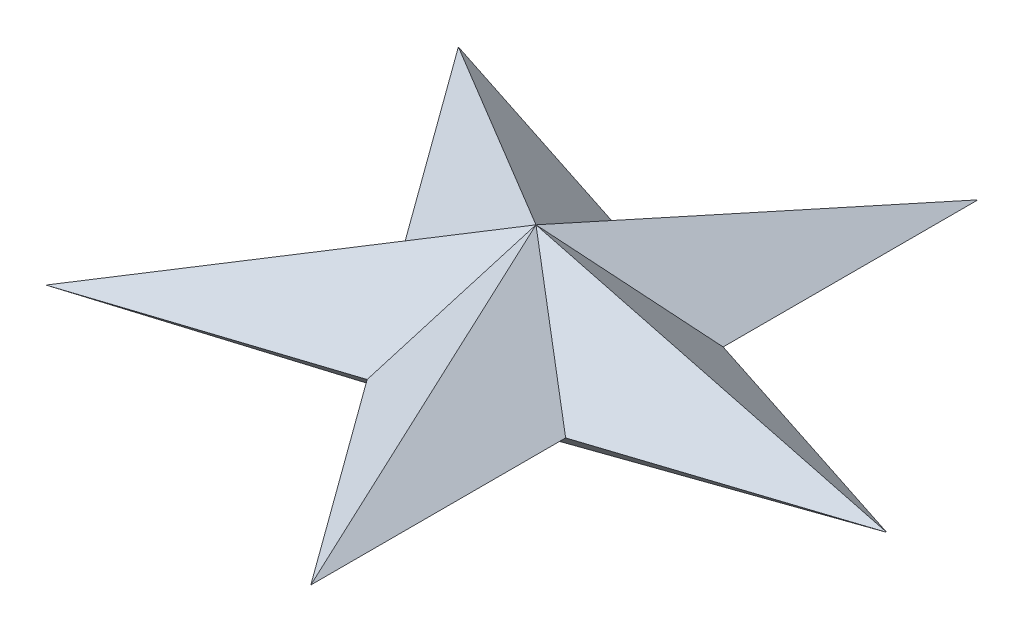
ISO-10303-21;
HEADER;
FILE_DESCRIPTION(('STEP AP214'),'2;1');
FILE_NAME('part.step','',(''),(''),'','','');
FILE_SCHEMA(('AUTOMOTIVE_DESIGN { 1 0 10303 214 1 1 1 1 }'));
ENDSEC;
DATA;
#1=APPLICATION_CONTEXT('core data for automotive mechanical design processes');
#2=APPLICATION_PROTOCOL_DEFINITION('international standard','automotive_design',2000,#1);
#3=PRODUCT_CONTEXT('',#1,'mechanical');
#4=PRODUCT('Part','Part','',(#3));
#5=PRODUCT_RELATED_PRODUCT_CATEGORY('part','',(#4));
#6=PRODUCT_DEFINITION_FORMATION('','',#4);
#7=PRODUCT_DEFINITION_CONTEXT('part definition',#1,'design');
#8=PRODUCT_DEFINITION('design','',#6,#7);
#9=PRODUCT_DEFINITION_SHAPE('','',#8);
#10=(LENGTH_UNIT() NAMED_UNIT(*) SI_UNIT(.MILLI.,.METRE.));
#11=(NAMED_UNIT(*) PLANE_ANGLE_UNIT() SI_UNIT($,.RADIAN.));
#12=(NAMED_UNIT(*) SI_UNIT($,.STERADIAN.) SOLID_ANGLE_UNIT());
#13=UNCERTAINTY_MEASURE_WITH_UNIT(LENGTH_MEASURE(1.E-05),#10,'distance_accuracy_value','');
#14=(GEOMETRIC_REPRESENTATION_CONTEXT(3) GLOBAL_UNCERTAINTY_ASSIGNED_CONTEXT((#13)) GLOBAL_UNIT_ASSIGNED_CONTEXT((#10,
#11,#12)) REPRESENTATION_CONTEXT('',''));
#15=CARTESIAN_POINT('',(0.,0.,0.));
#16=DIRECTION('',(0.,0.,1.));
#17=DIRECTION('',(1.,0.,0.));
#18=AXIS2_PLACEMENT_3D('',#15,#16,#17);
#19=CARTESIAN_POINT('',(-23.606797749979,0.,0.));
#20=DIRECTION('',(-0.52002610001006,-0.766044443118979,0.377821077330077));
#21=DIRECTION('',(0.827370262224102,-0.561656878518567,0.));
#22=AXIS2_PLACEMENT_3D('',#19,#20,#21);
#23=PLANE('',#22);
#24=DIRECTION('',(0.587785252292473,0.,0.809016994374948));
#25=VECTOR('',#24,1.);
#26=CARTESIAN_POINT('',(-23.606797749979,0.,0.));
#27=LINE('',#26,#25);
#28=CARTESIAN_POINT('',(-50.0000000000001,0.,-36.3271264002682));
#29=VERTEX_POINT('',#28);
#30=CARTESIAN_POINT('',(-23.606797749979,0.,0.));
#31=VERTEX_POINT('',#30);
#32=EDGE_CURVE('E86',#29,#31,#27,.T.);
#33=ORIENTED_EDGE('',*,*,#32,.F.);
#34=DIRECTION('',(-0.783118942211635,0.250995525039571,-0.568969216003326));
#35=VECTOR('',#34,1.);
#36=CARTESIAN_POINT('',(-50.0000000000001,0.,-36.3271264002682));
#37=LINE('',#36,#35);
#38=CARTESIAN_POINT('',(0.,-16.025376958111,0.));
#39=VERTEX_POINT('',#38);
#40=EDGE_CURVE('E11',#39,#29,#37,.T.);
#41=ORIENTED_EDGE('',*,*,#40,.F.);
#42=DIRECTION('',(-0.827370262224102,0.561656878518567,0.));
#43=VECTOR('',#42,1.);
#44=CARTESIAN_POINT('',(-41.6740413491238,12.2648735477293,0.));
#45=LINE('',#44,#43);
#46=EDGE_CURVE('E88',#39,#31,#45,.T.);
#47=ORIENTED_EDGE('',*,*,#46,.T.);
#48=EDGE_LOOP('',(#33,#41,#47));
#49=FACE_BOUND('',#48,.T.);
#50=ADVANCED_FACE('F35',(#49),#23,.T.);
#51=CARTESIAN_POINT('',(-50.0000000000001,0.,-36.3271264002682));
#52=DIRECTION('',(0.198632295166791,-0.766044443118979,-0.611327344786167));
#53=DIRECTION('',(0.,0.623756259233988,-0.781618915499377));
#54=AXIS2_PLACEMENT_3D('',#51,#52,#53);
#55=PLANE('',#54);
#56=DIRECTION('',(-0.951056516295153,0.,-0.309016994374948));
#57=VECTOR('',#56,1.);
#58=CARTESIAN_POINT('',(-50.0000000000001,0.,-36.3271264002682));
#59=LINE('',#58,#57);
#60=CARTESIAN_POINT('',(-7.2949016875158,0.,-22.4513988289793));
#61=VERTEX_POINT('',#60);
#62=EDGE_CURVE('E97',#61,#29,#59,.T.);
#63=ORIENTED_EDGE('',*,*,#62,.F.);
#64=DIRECTION('',(-0.255671471667704,0.561656878518567,-0.786875879277062));
#65=VECTOR('',#64,1.);
#66=CARTESIAN_POINT('',(-12.8779870011635,12.2648735477293,-39.6343685854379));
#67=LINE('',#66,#65);
#68=EDGE_CURVE('E39',#39,#61,#67,.T.);
#69=ORIENTED_EDGE('',*,*,#68,.F.);
#70=ORIENTED_EDGE('',*,*,#40,.T.);
#71=EDGE_LOOP('',(#63,#69,#70));
#72=FACE_BOUND('',#71,.T.);
#73=ADVANCED_FACE('F37',(#72),#55,.T.);
#74=CARTESIAN_POINT('',(-7.2949016875158,0.,-22.4513988289793));
#75=DIRECTION('',(-0.52002610001006,-0.766044443118979,-0.377821077330078));
#76=DIRECTION('',(0.827370262224102,-0.561656878518567,0.));
#77=AXIS2_PLACEMENT_3D('',#74,#75,#76);
#78=PLANE('',#77);
#79=DIRECTION('',(-0.587785252292473,0.,0.809016994374947));
#80=VECTOR('',#79,1.);
#81=CARTESIAN_POINT('',(-7.2949016875158,0.,-22.4513988289793));
#82=LINE('',#81,#80);
#83=CARTESIAN_POINT('',(19.0983005625053,0.,-58.7785252292474));
#84=VERTEX_POINT('',#83);
#85=EDGE_CURVE('E109',#84,#61,#82,.T.);
#86=ORIENTED_EDGE('',*,*,#85,.F.);
#87=DIRECTION('',(0.29912481869098,0.250995525039571,-0.920611530045761));
#88=VECTOR('',#87,1.);
#89=CARTESIAN_POINT('',(19.0983005625053,0.,-58.7785252292474));
#90=LINE('',#89,#88);
#91=EDGE_CURVE('E127',#39,#84,#90,.T.);
#92=ORIENTED_EDGE('',*,*,#91,.F.);
#93=ORIENTED_EDGE('',*,*,#68,.T.);
#94=EDGE_LOOP('',(#86,#92,#93));
#95=FACE_BOUND('',#94,.T.);
#96=ADVANCED_FACE('F136',(#95),#78,.T.);
#97=CARTESIAN_POINT('',(19.0983005625053,0.,-58.7785252292474));
#98=DIRECTION('',(0.642787609686538,-0.766044443118979,0.));
#99=DIRECTION('',(0.766044443118979,0.642787609686538,0.));
#100=AXIS2_PLACEMENT_3D('',#97,#98,#99);
#101=PLANE('',#100);
#102=DIRECTION('',(0.,0.,-1.));
#103=VECTOR('',#102,1.);
#104=CARTESIAN_POINT('',(19.0983005625053,0.,-58.7785252292474));
#105=LINE('',#104,#103);
#106=CARTESIAN_POINT('',(19.0983005625053,0.,-13.8757275712888));
#107=VERTEX_POINT('',#106);
#108=EDGE_CURVE('E113',#107,#84,#105,.T.);
#109=ORIENTED_EDGE('',*,*,#108,.F.);
#110=DIRECTION('',(0.669356602779755,0.561656878518567,-0.486316038320683));
#111=VECTOR('',#110,1.);
#112=CARTESIAN_POINT('',(33.7150076757254,12.2648735477293,-24.4953869084416));
#113=LINE('',#112,#111);
#114=EDGE_CURVE('E126',#39,#107,#113,.T.);
#115=ORIENTED_EDGE('',*,*,#114,.F.);
#116=ORIENTED_EDGE('',*,*,#91,.T.);
#117=EDGE_LOOP('',(#109,#115,#116));
#118=FACE_BOUND('',#117,.T.);
#119=ADVANCED_FACE('F131',(#118),#101,.T.);
#120=CARTESIAN_POINT('',(19.0983005625053,0.,-13.8757275712888));
#121=DIRECTION('',(0.198632295166791,-0.766044443118979,-0.611327344786168));
#122=DIRECTION('',(0.,0.623756259233988,-0.781618915499377));
#123=AXIS2_PLACEMENT_3D('',#120,#121,#122);
#124=PLANE('',#123);
#125=DIRECTION('',(-0.951056516295153,0.,-0.309016994374948));
#126=VECTOR('',#125,1.);
#127=CARTESIAN_POINT('',(19.0983005625053,0.,-13.8757275712888));
#128=LINE('',#127,#126);
#129=CARTESIAN_POINT('',(61.8033988749896,0.,0.));
#130=VERTEX_POINT('',#129);
#131=EDGE_CURVE('E147',#130,#107,#128,.T.);
#132=ORIENTED_EDGE('',*,*,#131,.F.);
#133=DIRECTION('',(0.967988247041311,0.250995525039571,0.));
#134=VECTOR('',#133,1.);
#135=CARTESIAN_POINT('',(61.8033988749896,0.,0.));
#136=LINE('',#135,#134);
#137=EDGE_CURVE('E124',#39,#130,#136,.T.);
#138=ORIENTED_EDGE('',*,*,#137,.F.);
#139=ORIENTED_EDGE('',*,*,#114,.T.);
#140=EDGE_LOOP('',(#132,#138,#139));
#141=FACE_BOUND('',#140,.T.);
#142=ADVANCED_FACE('F203',(#141),#124,.T.);
#143=CARTESIAN_POINT('',(61.8033988749896,0.,0.));
#144=DIRECTION('',(0.19863229516679,-0.766044443118979,0.611327344786168));
#145=DIRECTION('',(0.,-0.623756259233988,-0.781618915499377));
#146=AXIS2_PLACEMENT_3D('',#143,#144,#145);
#147=PLANE('',#146);
#148=DIRECTION('',(0.951056516295154,0.,-0.309016994374947));
#149=VECTOR('',#148,1.);
#150=CARTESIAN_POINT('',(61.8033988749896,0.,0.));
#151=LINE('',#150,#149);
#152=CARTESIAN_POINT('',(19.0983005625053,0.,13.8757275712888));
#153=VERTEX_POINT('',#152);
#154=EDGE_CURVE('E148',#153,#130,#151,.T.);
#155=ORIENTED_EDGE('',*,*,#154,.F.);
#156=DIRECTION('',(0.669356602779755,0.561656878518567,0.486316038320684));
#157=VECTOR('',#156,1.);
#158=CARTESIAN_POINT('',(33.7150076757254,12.2648735477293,24.4953869084417));
#159=LINE('',#158,#157);
#160=EDGE_CURVE('E122',#39,#153,#159,.T.);
#161=ORIENTED_EDGE('',*,*,#160,.F.);
#162=ORIENTED_EDGE('',*,*,#137,.T.);
#163=EDGE_LOOP('',(#155,#161,#162));
#164=FACE_BOUND('',#163,.T.);
#165=ADVANCED_FACE('F207',(#164),#147,.T.);
#166=CARTESIAN_POINT('',(19.0983005625053,0.,13.8757275712888));
#167=DIRECTION('',(0.642787609686538,-0.766044443118979,0.));
#168=DIRECTION('',(0.766044443118979,0.642787609686538,0.));
#169=AXIS2_PLACEMENT_3D('',#166,#167,#168);
#170=PLANE('',#169);
#171=DIRECTION('',(0.,0.,-1.));
#172=VECTOR('',#171,1.);
#173=CARTESIAN_POINT('',(19.0983005625053,0.,13.8757275712888));
#174=LINE('',#173,#172);
#175=CARTESIAN_POINT('',(19.0983005625053,0.,58.7785252292474));
#176=VERTEX_POINT('',#175);
#177=EDGE_CURVE('E153',#176,#153,#174,.T.);
#178=ORIENTED_EDGE('',*,*,#177,.F.);
#179=DIRECTION('',(0.29912481869098,0.250995525039571,0.920611530045762));
#180=VECTOR('',#179,1.);
#181=CARTESIAN_POINT('',(19.0983005625053,0.,58.7785252292474));
#182=LINE('',#181,#180);
#183=EDGE_CURVE('E120',#39,#176,#182,.T.);
#184=ORIENTED_EDGE('',*,*,#183,.F.);
#185=ORIENTED_EDGE('',*,*,#160,.T.);
#186=EDGE_LOOP('',(#178,#184,#185));
#187=FACE_BOUND('',#186,.T.);
#188=ADVANCED_FACE('F210',(#187),#170,.T.);
#189=CARTESIAN_POINT('',(19.0983005625053,0.,58.7785252292474));
#190=DIRECTION('',(-0.52002610001006,-0.766044443118979,0.377821077330077));
#191=DIRECTION('',(0.827370262224102,-0.561656878518567,0.));
#192=AXIS2_PLACEMENT_3D('',#189,#190,#191);
#193=PLANE('',#192);
#194=DIRECTION('',(0.587785252292473,0.,0.809016994374948));
#195=VECTOR('',#194,1.);
#196=CARTESIAN_POINT('',(19.0983005625053,0.,58.7785252292474));
#197=LINE('',#196,#195);
#198=CARTESIAN_POINT('',(-7.2949016875158,0.,22.4513988289793));
#199=VERTEX_POINT('',#198);
#200=EDGE_CURVE('E156',#199,#176,#197,.T.);
#201=ORIENTED_EDGE('',*,*,#200,.F.);
#202=DIRECTION('',(-0.255671471667705,0.561656878518567,0.786875879277062));
#203=VECTOR('',#202,1.);
#204=CARTESIAN_POINT('',(-12.8779870011635,12.2648735477293,39.6343685854378));
#205=LINE('',#204,#203);
#206=EDGE_CURVE('E118',#39,#199,#205,.T.);
#207=ORIENTED_EDGE('',*,*,#206,.F.);
#208=ORIENTED_EDGE('',*,*,#183,.T.);
#209=EDGE_LOOP('',(#201,#207,#208));
#210=FACE_BOUND('',#209,.T.);
#211=ADVANCED_FACE('F213',(#210),#193,.T.);
#212=CARTESIAN_POINT('',(-7.2949016875158,0.,22.4513988289793));
#213=DIRECTION('',(0.19863229516679,-0.766044443118979,0.611327344786168));
#214=DIRECTION('',(0.,-0.623756259233988,-0.781618915499377));
#215=AXIS2_PLACEMENT_3D('',#212,#213,#214);
#216=PLANE('',#215);
#217=DIRECTION('',(0.951056516295154,0.,-0.309016994374947));
#218=VECTOR('',#217,1.);
#219=CARTESIAN_POINT('',(-7.2949016875158,0.,22.4513988289793));
#220=LINE('',#219,#218);
#221=CARTESIAN_POINT('',(-50.0000000000001,0.,36.3271264002681));
#222=VERTEX_POINT('',#221);
#223=EDGE_CURVE('E159',#222,#199,#220,.T.);
#224=ORIENTED_EDGE('',*,*,#223,.F.);
#225=DIRECTION('',(-0.783118942211636,0.250995525039571,0.568969216003325));
#226=VECTOR('',#225,1.);
#227=CARTESIAN_POINT('',(-50.0000000000001,0.,36.3271264002681));
#228=LINE('',#227,#226);
#229=EDGE_CURVE('E111',#39,#222,#228,.T.);
#230=ORIENTED_EDGE('',*,*,#229,.F.);
#231=ORIENTED_EDGE('',*,*,#206,.T.);
#232=EDGE_LOOP('',(#224,#230,#231));
#233=FACE_BOUND('',#232,.T.);
#234=ADVANCED_FACE('F215',(#233),#216,.T.);
#235=CARTESIAN_POINT('',(-50.0000000000001,0.,36.3271264002681));
#236=DIRECTION('',(-0.52002610001006,-0.766044443118979,-0.377821077330078));
#237=DIRECTION('',(0.827370262224102,-0.561656878518567,0.));
#238=AXIS2_PLACEMENT_3D('',#235,#236,#237);
#239=PLANE('',#238);
#240=DIRECTION('',(-0.587785252292473,0.,0.809016994374947));
#241=VECTOR('',#240,1.);
#242=CARTESIAN_POINT('',(-50.0000000000001,0.,36.3271264002681));
#243=LINE('',#242,#241);
#244=EDGE_CURVE('E93',#31,#222,#243,.T.);
#245=ORIENTED_EDGE('',*,*,#244,.F.);
#246=ORIENTED_EDGE('',*,*,#46,.F.);
#247=ORIENTED_EDGE('',*,*,#229,.T.);
#248=EDGE_LOOP('',(#245,#246,#247));
#249=FACE_BOUND('',#248,.T.);
#250=ADVANCED_FACE('F217',(#249),#239,.T.);
#251=CARTESIAN_POINT('',(-23.606797749979,0.,0.));
#252=DIRECTION('',(-0.52002610001006,0.766044443118979,0.377821077330077));
#253=DIRECTION('',(-0.827370262224102,-0.561656878518567,0.));
#254=AXIS2_PLACEMENT_3D('',#251,#252,#253);
#255=PLANE('',#254);
#256=ORIENTED_EDGE('',*,*,#32,.T.);
#257=DIRECTION('',(-0.827370262224102,-0.561656878518567,0.));
#258=VECTOR('',#257,1.);
#259=CARTESIAN_POINT('',(-23.606797749979,0.,0.));
#260=LINE('',#259,#258);
#261=CARTESIAN_POINT('',(0.,16.025376958111,0.));
#262=VERTEX_POINT('',#261);
#263=EDGE_CURVE('E94',#262,#31,#260,.T.);
#264=ORIENTED_EDGE('',*,*,#263,.F.);
#265=DIRECTION('',(-0.783118942211635,-0.250995525039571,-0.568969216003326));
#266=VECTOR('',#265,1.);
#267=CARTESIAN_POINT('',(-17.6274031240561,10.3756613609993,-12.8070580279213));
#268=LINE('',#267,#266);
#269=EDGE_CURVE('E100',#262,#29,#268,.T.);
#270=ORIENTED_EDGE('',*,*,#269,.T.);
#271=EDGE_LOOP('',(#256,#264,#270));
#272=FACE_BOUND('',#271,.T.);
#273=ADVANCED_FACE('F101',(#272),#255,.T.);
#274=CARTESIAN_POINT('',(-50.0000000000001,0.,36.3271264002681));
#275=DIRECTION('',(-0.52002610001006,0.766044443118979,-0.377821077330078));
#276=DIRECTION('',(-0.827370262224102,-0.561656878518567,0.));
#277=AXIS2_PLACEMENT_3D('',#274,#275,#276);
#278=PLANE('',#277);
#279=ORIENTED_EDGE('',*,*,#244,.T.);
#280=DIRECTION('',(-0.783118942211636,-0.250995525039571,0.568969216003325));
#281=VECTOR('',#280,1.);
#282=CARTESIAN_POINT('',(-17.6274031240561,10.3756613609993,12.8070580279213));
#283=LINE('',#282,#281);
#284=EDGE_CURVE('E164',#262,#222,#283,.T.);
#285=ORIENTED_EDGE('',*,*,#284,.F.);
#286=ORIENTED_EDGE('',*,*,#263,.T.);
#287=EDGE_LOOP('',(#279,#285,#286));
#288=FACE_BOUND('',#287,.T.);
#289=ADVANCED_FACE('F182',(#288),#278,.T.);
#290=CARTESIAN_POINT('',(-7.2949016875158,0.,22.4513988289793));
#291=DIRECTION('',(0.19863229516679,0.766044443118979,0.611327344786168));
#292=DIRECTION('',(0.,-0.623756259233988,0.781618915499377));
#293=AXIS2_PLACEMENT_3D('',#290,#291,#292);
#294=PLANE('',#293);
#295=ORIENTED_EDGE('',*,*,#223,.T.);
#296=DIRECTION('',(-0.255671471667705,-0.561656878518567,0.786875879277062));
#297=VECTOR('',#296,1.);
#298=CARTESIAN_POINT('',(-7.2949016875158,0.,22.4513988289793));
#299=LINE('',#298,#297);
#300=EDGE_CURVE('E167',#262,#199,#299,.T.);
#301=ORIENTED_EDGE('',*,*,#300,.F.);
#302=ORIENTED_EDGE('',*,*,#284,.T.);
#303=EDGE_LOOP('',(#295,#301,#302));
#304=FACE_BOUND('',#303,.T.);
#305=ADVANCED_FACE('F186',(#304),#294,.T.);
#306=CARTESIAN_POINT('',(19.0983005625053,0.,58.7785252292474));
#307=DIRECTION('',(-0.52002610001006,0.766044443118979,0.377821077330077));
#308=DIRECTION('',(-0.827370262224102,-0.561656878518567,0.));
#309=AXIS2_PLACEMENT_3D('',#306,#307,#308);
#310=PLANE('',#309);
#311=ORIENTED_EDGE('',*,*,#200,.T.);
#312=DIRECTION('',(0.29912481869098,-0.250995525039571,0.920611530045762));
#313=VECTOR('',#312,1.);
#314=CARTESIAN_POINT('',(6.73306885999334,10.3756613609993,20.7222551850689));
#315=LINE('',#314,#313);
#316=EDGE_CURVE('E170',#262,#176,#315,.T.);
#317=ORIENTED_EDGE('',*,*,#316,.F.);
#318=ORIENTED_EDGE('',*,*,#300,.T.);
#319=EDGE_LOOP('',(#311,#317,#318));
#320=FACE_BOUND('',#319,.T.);
#321=ADVANCED_FACE('F190',(#320),#310,.T.);
#322=CARTESIAN_POINT('',(19.0983005625053,0.,13.8757275712888));
#323=DIRECTION('',(0.642787609686538,0.766044443118979,0.));
#324=DIRECTION('',(-0.766044443118979,0.642787609686538,0.));
#325=AXIS2_PLACEMENT_3D('',#322,#323,#324);
#326=PLANE('',#325);
#327=ORIENTED_EDGE('',*,*,#177,.T.);
#328=DIRECTION('',(0.669356602779755,-0.561656878518567,0.486316038320684));
#329=VECTOR('',#328,1.);
#330=CARTESIAN_POINT('',(19.0983005625053,0.,13.8757275712888));
#331=LINE('',#330,#329);
#332=EDGE_CURVE('E173',#262,#153,#331,.T.);
#333=ORIENTED_EDGE('',*,*,#332,.F.);
#334=ORIENTED_EDGE('',*,*,#316,.T.);
#335=EDGE_LOOP('',(#327,#333,#334));
#336=FACE_BOUND('',#335,.T.);
#337=ADVANCED_FACE('F194',(#336),#326,.T.);
#338=CARTESIAN_POINT('',(61.8033988749896,0.,0.));
#339=DIRECTION('',(0.19863229516679,0.766044443118979,0.611327344786168));
#340=DIRECTION('',(0.,-0.623756259233988,0.781618915499377));
#341=AXIS2_PLACEMENT_3D('',#338,#339,#340);
#342=PLANE('',#341);
#343=ORIENTED_EDGE('',*,*,#154,.T.);
#344=DIRECTION('',(0.967988247041311,-0.250995525039571,0.));
#345=VECTOR('',#344,1.);
#346=CARTESIAN_POINT('',(21.7886685281255,10.3756613609993,0.));
#347=LINE('',#346,#345);
#348=EDGE_CURVE('E176',#262,#130,#347,.T.);
#349=ORIENTED_EDGE('',*,*,#348,.F.);
#350=ORIENTED_EDGE('',*,*,#332,.T.);
#351=EDGE_LOOP('',(#343,#349,#350));
#352=FACE_BOUND('',#351,.T.);
#353=ADVANCED_FACE('F197',(#352),#342,.T.);
#354=CARTESIAN_POINT('',(19.0983005625053,0.,-13.8757275712888));
#355=DIRECTION('',(0.198632295166791,0.766044443118979,-0.611327344786168));
#356=DIRECTION('',(0.,0.623756259233988,0.781618915499377));
#357=AXIS2_PLACEMENT_3D('',#354,#355,#356);
#358=PLANE('',#357);
#359=ORIENTED_EDGE('',*,*,#131,.T.);
#360=DIRECTION('',(0.669356602779755,-0.561656878518567,-0.486316038320683));
#361=VECTOR('',#360,1.);
#362=CARTESIAN_POINT('',(19.0983005625053,0.,-13.8757275712888));
#363=LINE('',#362,#361);
#364=EDGE_CURVE('E142',#262,#107,#363,.T.);
#365=ORIENTED_EDGE('',*,*,#364,.F.);
#366=ORIENTED_EDGE('',*,*,#348,.T.);
#367=EDGE_LOOP('',(#359,#365,#366));
#368=FACE_BOUND('',#367,.T.);
#369=ADVANCED_FACE('F200',(#368),#358,.T.);
#370=CARTESIAN_POINT('',(19.0983005625053,0.,-58.7785252292474));
#371=DIRECTION('',(0.642787609686538,0.766044443118979,0.));
#372=DIRECTION('',(-0.766044443118979,0.642787609686538,0.));
#373=AXIS2_PLACEMENT_3D('',#370,#371,#372);
#374=PLANE('',#373);
#375=ORIENTED_EDGE('',*,*,#108,.T.);
#376=DIRECTION('',(0.29912481869098,-0.250995525039571,-0.920611530045761));
#377=VECTOR('',#376,1.);
#378=CARTESIAN_POINT('',(6.73306885999335,10.3756613609993,-20.7222551850689));
#379=LINE('',#378,#377);
#380=EDGE_CURVE('E139',#262,#84,#379,.T.);
#381=ORIENTED_EDGE('',*,*,#380,.F.);
#382=ORIENTED_EDGE('',*,*,#364,.T.);
#383=EDGE_LOOP('',(#375,#381,#382));
#384=FACE_BOUND('',#383,.T.);
#385=ADVANCED_FACE('F144',(#384),#374,.T.);
#386=CARTESIAN_POINT('',(-7.2949016875158,0.,-22.4513988289793));
#387=DIRECTION('',(-0.52002610001006,0.766044443118979,-0.377821077330078));
#388=DIRECTION('',(-0.827370262224102,-0.561656878518567,0.));
#389=AXIS2_PLACEMENT_3D('',#386,#387,#388);
#390=PLANE('',#389);
#391=ORIENTED_EDGE('',*,*,#85,.T.);
#392=DIRECTION('',(-0.255671471667704,-0.561656878518567,-0.786875879277062));
#393=VECTOR('',#392,1.);
#394=CARTESIAN_POINT('',(-7.2949016875158,0.,-22.4513988289793));
#395=LINE('',#394,#393);
#396=EDGE_CURVE('E104',#262,#61,#395,.T.);
#397=ORIENTED_EDGE('',*,*,#396,.F.);
#398=ORIENTED_EDGE('',*,*,#380,.T.);
#399=EDGE_LOOP('',(#391,#397,#398));
#400=FACE_BOUND('',#399,.T.);
#401=ADVANCED_FACE('F140',(#400),#390,.T.);
#402=CARTESIAN_POINT('',(-50.0000000000001,0.,-36.3271264002682));
#403=DIRECTION('',(0.198632295166791,0.766044443118979,-0.611327344786167));
#404=DIRECTION('',(0.,0.623756259233988,0.781618915499377));
#405=AXIS2_PLACEMENT_3D('',#402,#403,#404);
#406=PLANE('',#405);
#407=ORIENTED_EDGE('',*,*,#62,.T.);
#408=ORIENTED_EDGE('',*,*,#269,.F.);
#409=ORIENTED_EDGE('',*,*,#396,.T.);
#410=EDGE_LOOP('',(#407,#408,#409));
#411=FACE_BOUND('',#410,.T.);
#412=ADVANCED_FACE('F106',(#411),#406,.T.);
#413=CLOSED_SHELL('',(#50,#73,#96,#119,#142,#165,#188,#211,#234,#250,#273,#289,#305,#321,#337,
#353,#369,#385,#401,#412));
#414=MANIFOLD_SOLID_BREP('B2',#413);
#415=ADVANCED_BREP_SHAPE_REPRESENTATION('',(#18,#414),#14);
#416=SHAPE_DEFINITION_REPRESENTATION(#9,#415);
ENDSEC;
END-ISO-10303-21;
